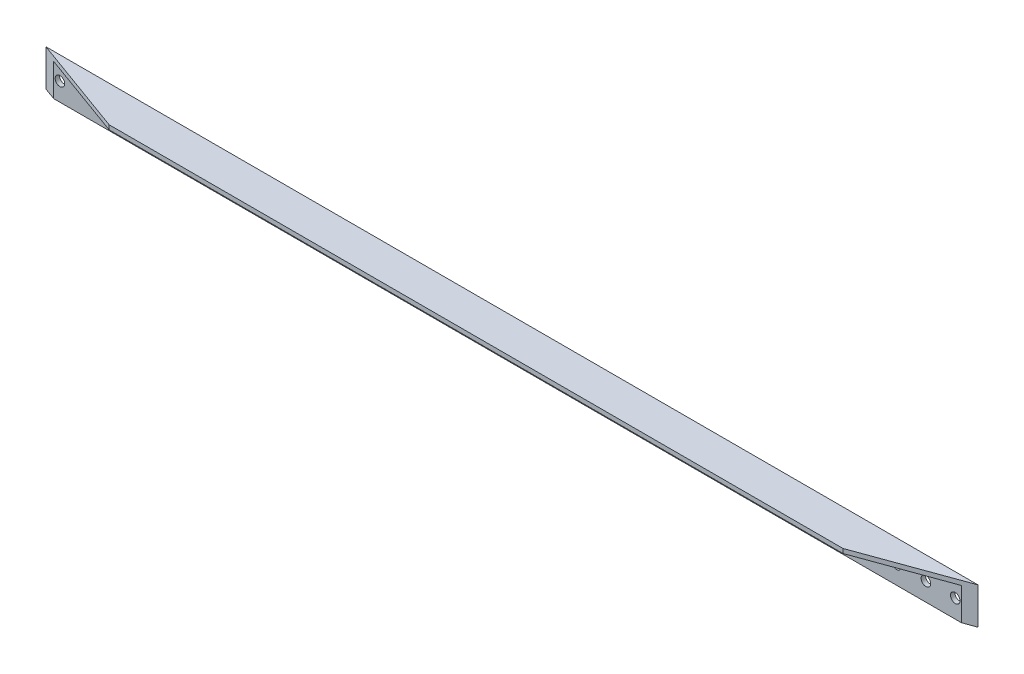
ISO-10303-21;
HEADER;
FILE_DESCRIPTION(('STEP AP214'),'2;1');
FILE_NAME('part.step','',(''),(''),'','','');
FILE_SCHEMA(('AUTOMOTIVE_DESIGN { 1 0 10303 214 1 1 1 1 }'));
ENDSEC;
DATA;
#1=APPLICATION_CONTEXT('core data for automotive mechanical design processes');
#2=APPLICATION_PROTOCOL_DEFINITION('international standard','automotive_design',2000,#1);
#3=PRODUCT_CONTEXT('',#1,'mechanical');
#4=PRODUCT('Part','Part','',(#3));
#5=PRODUCT_RELATED_PRODUCT_CATEGORY('part','',(#4));
#6=PRODUCT_DEFINITION_FORMATION('','',#4);
#7=PRODUCT_DEFINITION_CONTEXT('part definition',#1,'design');
#8=PRODUCT_DEFINITION('design','',#6,#7);
#9=PRODUCT_DEFINITION_SHAPE('','',#8);
#10=(LENGTH_UNIT() NAMED_UNIT(*) SI_UNIT(.MILLI.,.METRE.));
#11=(NAMED_UNIT(*) PLANE_ANGLE_UNIT() SI_UNIT($,.RADIAN.));
#12=(NAMED_UNIT(*) SI_UNIT($,.STERADIAN.) SOLID_ANGLE_UNIT());
#13=UNCERTAINTY_MEASURE_WITH_UNIT(LENGTH_MEASURE(1.E-05),#10,'distance_accuracy_value','');
#14=(GEOMETRIC_REPRESENTATION_CONTEXT(3) GLOBAL_UNCERTAINTY_ASSIGNED_CONTEXT((#13)) GLOBAL_UNIT_ASSIGNED_CONTEXT((#10,
#11,#12)) REPRESENTATION_CONTEXT('',''));
#15=CARTESIAN_POINT('',(0.,0.,0.));
#16=DIRECTION('',(0.,0.,1.));
#17=DIRECTION('',(1.,0.,0.));
#18=AXIS2_PLACEMENT_3D('',#15,#16,#17);
#19=CARTESIAN_POINT('',(-1270.,-50.,12.));
#20=DIRECTION('',(0.,0.,1.));
#21=DIRECTION('',(1.,0.,0.));
#22=AXIS2_PLACEMENT_3D('',#19,#20,#21);
#23=PLANE('',#22);
#24=DIRECTION('',(0.,1.,0.));
#25=VECTOR('',#24,1.);
#26=CARTESIAN_POINT('',(-1236.9387755102,-50.,12.));
#27=LINE('',#26,#25);
#28=CARTESIAN_POINT('',(-1236.9387755102,-50.,12.));
#29=VERTEX_POINT('',#28);
#30=CARTESIAN_POINT('',(-1236.9387755102,38.,12.));
#31=VERTEX_POINT('',#30);
#32=EDGE_CURVE('E250',#29,#31,#27,.T.);
#33=ORIENTED_EDGE('',*,*,#32,.F.);
#34=DIRECTION('',(1.,0.,0.));
#35=VECTOR('',#34,1.);
#36=CARTESIAN_POINT('',(-1270.,-50.,12.));
#37=LINE('',#36,#35);
#38=CARTESIAN_POINT('',(1236.9387755102,-50.,12.));
#39=VERTEX_POINT('',#38);
#40=EDGE_CURVE('E216',#29,#39,#37,.T.);
#41=ORIENTED_EDGE('',*,*,#40,.T.);
#42=DIRECTION('',(0.,-1.,0.));
#43=VECTOR('',#42,1.);
#44=CARTESIAN_POINT('',(1236.9387755102,-50.,12.));
#45=LINE('',#44,#43);
#46=CARTESIAN_POINT('',(1236.9387755102,38.,11.9999999999999));
#47=VERTEX_POINT('',#46);
#48=EDGE_CURVE('E234',#47,#39,#45,.T.);
#49=ORIENTED_EDGE('',*,*,#48,.F.);
#50=DIRECTION('',(1.,0.,0.));
#51=VECTOR('',#50,1.);
#52=CARTESIAN_POINT('',(-1270.,38.,12.));
#53=LINE('',#52,#51);
#54=EDGE_CURVE('E37',#31,#47,#53,.T.);
#55=ORIENTED_EDGE('',*,*,#54,.F.);
#56=EDGE_LOOP('',(#33,#41,#49,#55));
#57=FACE_BOUND('',#56,.T.);
#58=CARTESIAN_POINT('',(-1140.,0.,12.));
#59=DIRECTION('',(0.,0.,1.));
#60=DIRECTION('',(-1.,0.,0.));
#61=AXIS2_PLACEMENT_3D('',#58,#59,#60);
#62=CIRCLE('',#61,12.9999999999998);
#63=CARTESIAN_POINT('',(-1153.,0.,12.));
#64=VERTEX_POINT('',#63);
#65=EDGE_CURVE('E114',#64,#64,#62,.T.);
#66=ORIENTED_EDGE('',*,*,#65,.F.);
#67=EDGE_LOOP('',(#66));
#68=FACE_BOUND('',#67,.T.);
#69=CARTESIAN_POINT('',(-979.999999999999,0.,12.));
#70=DIRECTION('',(0.,0.,1.));
#71=DIRECTION('',(-1.,0.,0.));
#72=AXIS2_PLACEMENT_3D('',#69,#70,#71);
#73=CIRCLE('',#72,13.);
#74=CARTESIAN_POINT('',(-992.999999999999,0.,12.));
#75=VERTEX_POINT('',#74);
#76=EDGE_CURVE('E126',#75,#75,#73,.T.);
#77=ORIENTED_EDGE('',*,*,#76,.F.);
#78=EDGE_LOOP('',(#77));
#79=FACE_BOUND('',#78,.T.);
#80=CARTESIAN_POINT('',(-459.999999999999,0.,12.));
#81=DIRECTION('',(0.,0.,1.));
#82=DIRECTION('',(-1.,0.,0.));
#83=AXIS2_PLACEMENT_3D('',#80,#81,#82);
#84=CIRCLE('',#83,13.);
#85=CARTESIAN_POINT('',(-472.999999999999,0.,12.));
#86=VERTEX_POINT('',#85);
#87=EDGE_CURVE('E138',#86,#86,#84,.T.);
#88=ORIENTED_EDGE('',*,*,#87,.F.);
#89=EDGE_LOOP('',(#88));
#90=FACE_BOUND('',#89,.T.);
#91=CARTESIAN_POINT('',(-299.999999999999,0.,12.));
#92=DIRECTION('',(0.,0.,1.));
#93=DIRECTION('',(-1.,0.,0.));
#94=AXIS2_PLACEMENT_3D('',#91,#92,#93);
#95=CIRCLE('',#94,13.);
#96=CARTESIAN_POINT('',(-312.999999999999,0.,12.));
#97=VERTEX_POINT('',#96);
#98=EDGE_CURVE('E150',#97,#97,#95,.T.);
#99=ORIENTED_EDGE('',*,*,#98,.F.);
#100=EDGE_LOOP('',(#99));
#101=FACE_BOUND('',#100,.T.);
#102=CARTESIAN_POINT('',(179.999999999999,0.,12.));
#103=DIRECTION('',(0.,0.,1.));
#104=DIRECTION('',(1.,0.,0.));
#105=AXIS2_PLACEMENT_3D('',#102,#103,#104);
#106=CIRCLE('',#105,13.);
#107=CARTESIAN_POINT('',(192.999999999999,0.,12.));
#108=VERTEX_POINT('',#107);
#109=EDGE_CURVE('E162',#108,#108,#106,.T.);
#110=ORIENTED_EDGE('',*,*,#109,.F.);
#111=EDGE_LOOP('',(#110));
#112=FACE_BOUND('',#111,.T.);
#113=CARTESIAN_POINT('',(379.999999999999,0.,12.));
#114=DIRECTION('',(0.,0.,1.));
#115=DIRECTION('',(1.,0.,0.));
#116=AXIS2_PLACEMENT_3D('',#113,#114,#115);
#117=CIRCLE('',#116,13.);
#118=CARTESIAN_POINT('',(392.999999999999,0.,12.));
#119=VERTEX_POINT('',#118);
#120=EDGE_CURVE('E174',#119,#119,#117,.T.);
#121=ORIENTED_EDGE('',*,*,#120,.F.);
#122=EDGE_LOOP('',(#121));
#123=FACE_BOUND('',#122,.T.);
#124=CARTESIAN_POINT('',(579.999999999999,0.,12.));
#125=DIRECTION('',(0.,0.,1.));
#126=DIRECTION('',(1.,0.,0.));
#127=AXIS2_PLACEMENT_3D('',#124,#125,#126);
#128=CIRCLE('',#127,13.);
#129=CARTESIAN_POINT('',(592.999999999999,0.,12.));
#130=VERTEX_POINT('',#129);
#131=EDGE_CURVE('E186',#130,#130,#128,.T.);
#132=ORIENTED_EDGE('',*,*,#131,.F.);
#133=EDGE_LOOP('',(#132));
#134=FACE_BOUND('',#133,.T.);
#135=CARTESIAN_POINT('',(1060.,0.,12.));
#136=DIRECTION('',(0.,0.,1.));
#137=DIRECTION('',(1.,0.,0.));
#138=AXIS2_PLACEMENT_3D('',#135,#136,#137);
#139=CIRCLE('',#138,12.9999999999998);
#140=CARTESIAN_POINT('',(1073.,0.,12.));
#141=VERTEX_POINT('',#140);
#142=EDGE_CURVE('E198',#141,#141,#139,.T.);
#143=ORIENTED_EDGE('',*,*,#142,.F.);
#144=EDGE_LOOP('',(#143));
#145=FACE_BOUND('',#144,.T.);
#146=CARTESIAN_POINT('',(1220.,0.,12.));
#147=DIRECTION('',(0.,0.,1.));
#148=DIRECTION('',(1.,0.,0.));
#149=AXIS2_PLACEMENT_3D('',#146,#147,#148);
#150=CIRCLE('',#149,12.9999999999998);
#151=CARTESIAN_POINT('',(1233.,0.,12.));
#152=VERTEX_POINT('',#151);
#153=EDGE_CURVE('E210',#152,#152,#150,.T.);
#154=ORIENTED_EDGE('',*,*,#153,.F.);
#155=EDGE_LOOP('',(#154));
#156=FACE_BOUND('',#155,.T.);
#157=CARTESIAN_POINT('',(1140.,0.,12.));
#158=DIRECTION('',(0.,0.,1.));
#159=DIRECTION('',(1.,0.,0.));
#160=AXIS2_PLACEMENT_3D('',#157,#158,#159);
#161=CIRCLE('',#160,12.9999999999998);
#162=CARTESIAN_POINT('',(1153.,0.,12.));
#163=VERTEX_POINT('',#162);
#164=EDGE_CURVE('E204',#163,#163,#161,.T.);
#165=ORIENTED_EDGE('',*,*,#164,.F.);
#166=EDGE_LOOP('',(#165));
#167=FACE_BOUND('',#166,.T.);
#168=CARTESIAN_POINT('',(979.999999999999,0.,12.));
#169=DIRECTION('',(0.,0.,1.));
#170=DIRECTION('',(1.,0.,0.));
#171=AXIS2_PLACEMENT_3D('',#168,#169,#170);
#172=CIRCLE('',#171,13.);
#173=CARTESIAN_POINT('',(992.999999999999,0.,12.));
#174=VERTEX_POINT('',#173);
#175=EDGE_CURVE('E192',#174,#174,#172,.T.);
#176=ORIENTED_EDGE('',*,*,#175,.F.);
#177=EDGE_LOOP('',(#176));
#178=FACE_BOUND('',#177,.T.);
#179=CARTESIAN_POINT('',(459.999999999999,0.,12.));
#180=DIRECTION('',(0.,0.,1.));
#181=DIRECTION('',(1.,0.,0.));
#182=AXIS2_PLACEMENT_3D('',#179,#180,#181);
#183=CIRCLE('',#182,13.);
#184=CARTESIAN_POINT('',(472.999999999999,0.,12.));
#185=VERTEX_POINT('',#184);
#186=EDGE_CURVE('E180',#185,#185,#183,.T.);
#187=ORIENTED_EDGE('',*,*,#186,.F.);
#188=EDGE_LOOP('',(#187));
#189=FACE_BOUND('',#188,.T.);
#190=CARTESIAN_POINT('',(299.999999999999,0.,12.));
#191=DIRECTION('',(0.,0.,1.));
#192=DIRECTION('',(1.,0.,0.));
#193=AXIS2_PLACEMENT_3D('',#190,#191,#192);
#194=CIRCLE('',#193,13.);
#195=CARTESIAN_POINT('',(312.999999999999,0.,12.));
#196=VERTEX_POINT('',#195);
#197=EDGE_CURVE('E168',#196,#196,#194,.T.);
#198=ORIENTED_EDGE('',*,*,#197,.F.);
#199=EDGE_LOOP('',(#198));
#200=FACE_BOUND('',#199,.T.);
#201=CARTESIAN_POINT('',(-179.999999999999,0.,12.));
#202=DIRECTION('',(0.,0.,1.));
#203=DIRECTION('',(-1.,0.,0.));
#204=AXIS2_PLACEMENT_3D('',#201,#202,#203);
#205=CIRCLE('',#204,13.);
#206=CARTESIAN_POINT('',(-192.999999999999,0.,12.));
#207=VERTEX_POINT('',#206);
#208=EDGE_CURVE('E156',#207,#207,#205,.T.);
#209=ORIENTED_EDGE('',*,*,#208,.F.);
#210=EDGE_LOOP('',(#209));
#211=FACE_BOUND('',#210,.T.);
#212=CARTESIAN_POINT('',(-379.999999999999,0.,12.));
#213=DIRECTION('',(0.,0.,1.));
#214=DIRECTION('',(-1.,0.,0.));
#215=AXIS2_PLACEMENT_3D('',#212,#213,#214);
#216=CIRCLE('',#215,13.);
#217=CARTESIAN_POINT('',(-392.999999999999,0.,12.));
#218=VERTEX_POINT('',#217);
#219=EDGE_CURVE('E144',#218,#218,#216,.T.);
#220=ORIENTED_EDGE('',*,*,#219,.F.);
#221=EDGE_LOOP('',(#220));
#222=FACE_BOUND('',#221,.T.);
#223=CARTESIAN_POINT('',(-579.999999999999,0.,12.));
#224=DIRECTION('',(0.,0.,1.));
#225=DIRECTION('',(-1.,0.,0.));
#226=AXIS2_PLACEMENT_3D('',#223,#224,#225);
#227=CIRCLE('',#226,13.);
#228=CARTESIAN_POINT('',(-592.999999999999,0.,12.));
#229=VERTEX_POINT('',#228);
#230=EDGE_CURVE('E132',#229,#229,#227,.T.);
#231=ORIENTED_EDGE('',*,*,#230,.F.);
#232=EDGE_LOOP('',(#231));
#233=FACE_BOUND('',#232,.T.);
#234=CARTESIAN_POINT('',(-1060.,0.,12.));
#235=DIRECTION('',(0.,0.,1.));
#236=DIRECTION('',(-1.,0.,0.));
#237=AXIS2_PLACEMENT_3D('',#234,#235,#236);
#238=CIRCLE('',#237,12.9999999999998);
#239=CARTESIAN_POINT('',(-1073.,0.,12.));
#240=VERTEX_POINT('',#239);
#241=EDGE_CURVE('E120',#240,#240,#238,.T.);
#242=ORIENTED_EDGE('',*,*,#241,.F.);
#243=EDGE_LOOP('',(#242));
#244=FACE_BOUND('',#243,.T.);
#245=CARTESIAN_POINT('',(-1220.,0.,12.));
#246=DIRECTION('',(0.,0.,1.));
#247=DIRECTION('',(-1.,0.,0.));
#248=AXIS2_PLACEMENT_3D('',#245,#246,#247);
#249=CIRCLE('',#248,12.9999999999998);
#250=CARTESIAN_POINT('',(-1233.,0.,12.));
#251=VERTEX_POINT('',#250);
#252=EDGE_CURVE('E105',#251,#251,#249,.T.);
#253=ORIENTED_EDGE('',*,*,#252,.F.);
#254=EDGE_LOOP('',(#253));
#255=FACE_BOUND('',#254,.T.);
#256=ADVANCED_FACE('F33',(#57,#68,#79,#90,#101,#112,#123,#134,#145,#156,#167,#178,#189,#200,
#211,#222,#233,#244,#255),#23,.T.);
#257=CARTESIAN_POINT('',(-1270.,-50.,0.));
#258=DIRECTION('',(0.,0.,1.));
#259=DIRECTION('',(1.,0.,0.));
#260=AXIS2_PLACEMENT_3D('',#257,#258,#259);
#261=PLANE('',#260);
#262=CARTESIAN_POINT('',(-1140.,0.,0.));
#263=DIRECTION('',(0.,0.,1.));
#264=DIRECTION('',(-1.,0.,0.));
#265=AXIS2_PLACEMENT_3D('',#262,#263,#264);
#266=CIRCLE('',#265,12.9999999999998);
#267=CARTESIAN_POINT('',(-1153.,0.,0.));
#268=VERTEX_POINT('',#267);
#269=EDGE_CURVE('E112',#268,#268,#266,.T.);
#270=ORIENTED_EDGE('',*,*,#269,.T.);
#271=EDGE_LOOP('',(#270));
#272=FACE_BOUND('',#271,.T.);
#273=CARTESIAN_POINT('',(-979.999999999999,0.,0.));
#274=DIRECTION('',(0.,0.,1.));
#275=DIRECTION('',(-1.,0.,0.));
#276=AXIS2_PLACEMENT_3D('',#273,#274,#275);
#277=CIRCLE('',#276,13.);
#278=CARTESIAN_POINT('',(-992.999999999999,0.,0.));
#279=VERTEX_POINT('',#278);
#280=EDGE_CURVE('E123',#279,#279,#277,.T.);
#281=ORIENTED_EDGE('',*,*,#280,.T.);
#282=EDGE_LOOP('',(#281));
#283=FACE_BOUND('',#282,.T.);
#284=CARTESIAN_POINT('',(-459.999999999999,0.,0.));
#285=DIRECTION('',(0.,0.,1.));
#286=DIRECTION('',(-1.,0.,0.));
#287=AXIS2_PLACEMENT_3D('',#284,#285,#286);
#288=CIRCLE('',#287,13.);
#289=CARTESIAN_POINT('',(-472.999999999999,0.,0.));
#290=VERTEX_POINT('',#289);
#291=EDGE_CURVE('E135',#290,#290,#288,.T.);
#292=ORIENTED_EDGE('',*,*,#291,.T.);
#293=EDGE_LOOP('',(#292));
#294=FACE_BOUND('',#293,.T.);
#295=CARTESIAN_POINT('',(-299.999999999999,0.,0.));
#296=DIRECTION('',(0.,0.,1.));
#297=DIRECTION('',(-1.,0.,0.));
#298=AXIS2_PLACEMENT_3D('',#295,#296,#297);
#299=CIRCLE('',#298,13.);
#300=CARTESIAN_POINT('',(-312.999999999999,0.,0.));
#301=VERTEX_POINT('',#300);
#302=EDGE_CURVE('E147',#301,#301,#299,.T.);
#303=ORIENTED_EDGE('',*,*,#302,.T.);
#304=EDGE_LOOP('',(#303));
#305=FACE_BOUND('',#304,.T.);
#306=CARTESIAN_POINT('',(179.999999999999,0.,0.));
#307=DIRECTION('',(0.,0.,1.));
#308=DIRECTION('',(1.,0.,0.));
#309=AXIS2_PLACEMENT_3D('',#306,#307,#308);
#310=CIRCLE('',#309,13.);
#311=CARTESIAN_POINT('',(192.999999999999,0.,0.));
#312=VERTEX_POINT('',#311);
#313=EDGE_CURVE('E159',#312,#312,#310,.T.);
#314=ORIENTED_EDGE('',*,*,#313,.T.);
#315=EDGE_LOOP('',(#314));
#316=FACE_BOUND('',#315,.T.);
#317=CARTESIAN_POINT('',(379.999999999999,0.,0.));
#318=DIRECTION('',(0.,0.,1.));
#319=DIRECTION('',(1.,0.,0.));
#320=AXIS2_PLACEMENT_3D('',#317,#318,#319);
#321=CIRCLE('',#320,13.);
#322=CARTESIAN_POINT('',(392.999999999999,0.,0.));
#323=VERTEX_POINT('',#322);
#324=EDGE_CURVE('E171',#323,#323,#321,.T.);
#325=ORIENTED_EDGE('',*,*,#324,.T.);
#326=EDGE_LOOP('',(#325));
#327=FACE_BOUND('',#326,.T.);
#328=CARTESIAN_POINT('',(579.999999999999,0.,0.));
#329=DIRECTION('',(0.,0.,1.));
#330=DIRECTION('',(1.,0.,0.));
#331=AXIS2_PLACEMENT_3D('',#328,#329,#330);
#332=CIRCLE('',#331,13.);
#333=CARTESIAN_POINT('',(592.999999999999,0.,0.));
#334=VERTEX_POINT('',#333);
#335=EDGE_CURVE('E183',#334,#334,#332,.T.);
#336=ORIENTED_EDGE('',*,*,#335,.T.);
#337=EDGE_LOOP('',(#336));
#338=FACE_BOUND('',#337,.T.);
#339=CARTESIAN_POINT('',(1060.,0.,0.));
#340=DIRECTION('',(0.,0.,1.));
#341=DIRECTION('',(1.,0.,0.));
#342=AXIS2_PLACEMENT_3D('',#339,#340,#341);
#343=CIRCLE('',#342,12.9999999999998);
#344=CARTESIAN_POINT('',(1073.,0.,0.));
#345=VERTEX_POINT('',#344);
#346=EDGE_CURVE('E195',#345,#345,#343,.T.);
#347=ORIENTED_EDGE('',*,*,#346,.T.);
#348=EDGE_LOOP('',(#347));
#349=FACE_BOUND('',#348,.T.);
#350=CARTESIAN_POINT('',(1220.,0.,0.));
#351=DIRECTION('',(0.,0.,1.));
#352=DIRECTION('',(1.,0.,0.));
#353=AXIS2_PLACEMENT_3D('',#350,#351,#352);
#354=CIRCLE('',#353,12.9999999999998);
#355=CARTESIAN_POINT('',(1233.,0.,0.));
#356=VERTEX_POINT('',#355);
#357=EDGE_CURVE('E207',#356,#356,#354,.T.);
#358=ORIENTED_EDGE('',*,*,#357,.T.);
#359=EDGE_LOOP('',(#358));
#360=FACE_BOUND('',#359,.T.);
#361=DIRECTION('',(0.,-1.,0.));
#362=VECTOR('',#361,1.);
#363=CARTESIAN_POINT('',(-1270.,50.,0.));
#364=LINE('',#363,#362);
#365=CARTESIAN_POINT('',(-1270.,50.,0.));
#366=VERTEX_POINT('',#365);
#367=CARTESIAN_POINT('',(-1270.,-50.,0.));
#368=VERTEX_POINT('',#367);
#369=EDGE_CURVE('E213',#366,#368,#364,.T.);
#370=ORIENTED_EDGE('',*,*,#369,.F.);
#371=DIRECTION('',(-1.,0.,0.));
#372=VECTOR('',#371,1.);
#373=CARTESIAN_POINT('',(-1270.,50.,0.));
#374=LINE('',#373,#372);
#375=CARTESIAN_POINT('',(1270.,50.,0.));
#376=VERTEX_POINT('',#375);
#377=EDGE_CURVE('E97',#376,#366,#374,.T.);
#378=ORIENTED_EDGE('',*,*,#377,.F.);
#379=DIRECTION('',(0.,1.,0.));
#380=VECTOR('',#379,1.);
#381=CARTESIAN_POINT('',(1270.,50.,0.));
#382=LINE('',#381,#380);
#383=CARTESIAN_POINT('',(1270.,-50.,0.));
#384=VERTEX_POINT('',#383);
#385=EDGE_CURVE('E222',#384,#376,#382,.T.);
#386=ORIENTED_EDGE('',*,*,#385,.F.);
#387=DIRECTION('',(1.,0.,0.));
#388=VECTOR('',#387,1.);
#389=CARTESIAN_POINT('',(-1270.,-50.,0.));
#390=LINE('',#389,#388);
#391=EDGE_CURVE('E219',#368,#384,#390,.T.);
#392=ORIENTED_EDGE('',*,*,#391,.F.);
#393=EDGE_LOOP('',(#370,#378,#386,#392));
#394=FACE_BOUND('',#393,.T.);
#395=CARTESIAN_POINT('',(1140.,0.,0.));
#396=DIRECTION('',(0.,0.,1.));
#397=DIRECTION('',(1.,0.,0.));
#398=AXIS2_PLACEMENT_3D('',#395,#396,#397);
#399=CIRCLE('',#398,12.9999999999998);
#400=CARTESIAN_POINT('',(1153.,0.,0.));
#401=VERTEX_POINT('',#400);
#402=EDGE_CURVE('E201',#401,#401,#399,.T.);
#403=ORIENTED_EDGE('',*,*,#402,.T.);
#404=EDGE_LOOP('',(#403));
#405=FACE_BOUND('',#404,.T.);
#406=CARTESIAN_POINT('',(979.999999999999,0.,0.));
#407=DIRECTION('',(0.,0.,1.));
#408=DIRECTION('',(1.,0.,0.));
#409=AXIS2_PLACEMENT_3D('',#406,#407,#408);
#410=CIRCLE('',#409,13.);
#411=CARTESIAN_POINT('',(992.999999999999,0.,0.));
#412=VERTEX_POINT('',#411);
#413=EDGE_CURVE('E189',#412,#412,#410,.T.);
#414=ORIENTED_EDGE('',*,*,#413,.T.);
#415=EDGE_LOOP('',(#414));
#416=FACE_BOUND('',#415,.T.);
#417=CARTESIAN_POINT('',(459.999999999999,0.,0.));
#418=DIRECTION('',(0.,0.,1.));
#419=DIRECTION('',(1.,0.,0.));
#420=AXIS2_PLACEMENT_3D('',#417,#418,#419);
#421=CIRCLE('',#420,13.);
#422=CARTESIAN_POINT('',(472.999999999999,0.,0.));
#423=VERTEX_POINT('',#422);
#424=EDGE_CURVE('E177',#423,#423,#421,.T.);
#425=ORIENTED_EDGE('',*,*,#424,.T.);
#426=EDGE_LOOP('',(#425));
#427=FACE_BOUND('',#426,.T.);
#428=CARTESIAN_POINT('',(299.999999999999,0.,0.));
#429=DIRECTION('',(0.,0.,1.));
#430=DIRECTION('',(1.,0.,0.));
#431=AXIS2_PLACEMENT_3D('',#428,#429,#430);
#432=CIRCLE('',#431,13.);
#433=CARTESIAN_POINT('',(312.999999999999,0.,0.));
#434=VERTEX_POINT('',#433);
#435=EDGE_CURVE('E165',#434,#434,#432,.T.);
#436=ORIENTED_EDGE('',*,*,#435,.T.);
#437=EDGE_LOOP('',(#436));
#438=FACE_BOUND('',#437,.T.);
#439=CARTESIAN_POINT('',(-179.999999999999,0.,0.));
#440=DIRECTION('',(0.,0.,1.));
#441=DIRECTION('',(-1.,0.,0.));
#442=AXIS2_PLACEMENT_3D('',#439,#440,#441);
#443=CIRCLE('',#442,13.);
#444=CARTESIAN_POINT('',(-192.999999999999,0.,0.));
#445=VERTEX_POINT('',#444);
#446=EDGE_CURVE('E153',#445,#445,#443,.T.);
#447=ORIENTED_EDGE('',*,*,#446,.T.);
#448=EDGE_LOOP('',(#447));
#449=FACE_BOUND('',#448,.T.);
#450=CARTESIAN_POINT('',(-379.999999999999,0.,0.));
#451=DIRECTION('',(0.,0.,1.));
#452=DIRECTION('',(-1.,0.,0.));
#453=AXIS2_PLACEMENT_3D('',#450,#451,#452);
#454=CIRCLE('',#453,13.);
#455=CARTESIAN_POINT('',(-392.999999999999,0.,0.));
#456=VERTEX_POINT('',#455);
#457=EDGE_CURVE('E141',#456,#456,#454,.T.);
#458=ORIENTED_EDGE('',*,*,#457,.T.);
#459=EDGE_LOOP('',(#458));
#460=FACE_BOUND('',#459,.T.);
#461=CARTESIAN_POINT('',(-579.999999999999,0.,0.));
#462=DIRECTION('',(0.,0.,1.));
#463=DIRECTION('',(-1.,0.,0.));
#464=AXIS2_PLACEMENT_3D('',#461,#462,#463);
#465=CIRCLE('',#464,13.);
#466=CARTESIAN_POINT('',(-592.999999999999,0.,0.));
#467=VERTEX_POINT('',#466);
#468=EDGE_CURVE('E129',#467,#467,#465,.T.);
#469=ORIENTED_EDGE('',*,*,#468,.T.);
#470=EDGE_LOOP('',(#469));
#471=FACE_BOUND('',#470,.T.);
#472=CARTESIAN_POINT('',(-1060.,0.,0.));
#473=DIRECTION('',(0.,0.,1.));
#474=DIRECTION('',(-1.,0.,0.));
#475=AXIS2_PLACEMENT_3D('',#472,#473,#474);
#476=CIRCLE('',#475,12.9999999999998);
#477=CARTESIAN_POINT('',(-1073.,0.,0.));
#478=VERTEX_POINT('',#477);
#479=EDGE_CURVE('E117',#478,#478,#476,.T.);
#480=ORIENTED_EDGE('',*,*,#479,.T.);
#481=EDGE_LOOP('',(#480));
#482=FACE_BOUND('',#481,.T.);
#483=CARTESIAN_POINT('',(-1220.,0.,0.));
#484=DIRECTION('',(0.,0.,1.));
#485=DIRECTION('',(-1.,0.,0.));
#486=AXIS2_PLACEMENT_3D('',#483,#484,#485);
#487=CIRCLE('',#486,12.9999999999998);
#488=CARTESIAN_POINT('',(-1233.,0.,0.));
#489=VERTEX_POINT('',#488);
#490=EDGE_CURVE('E101',#489,#489,#487,.T.);
#491=ORIENTED_EDGE('',*,*,#490,.T.);
#492=EDGE_LOOP('',(#491));
#493=FACE_BOUND('',#492,.T.);
#494=ADVANCED_FACE('F254',(#272,#283,#294,#305,#316,#327,#338,#349,#360,#394,#405,#416,#427,
#438,#449,#460,#471,#482,#493),#261,.F.);
#495=CARTESIAN_POINT('',(-1270.,-50.,12.));
#496=DIRECTION('',(0.,1.,0.));
#497=DIRECTION('',(0.,0.,1.));
#498=AXIS2_PLACEMENT_3D('',#495,#496,#497);
#499=PLANE('',#498);
#500=ORIENTED_EDGE('',*,*,#40,.F.);
#501=DIRECTION('',(-0.939996554641713,0.,-0.341183934647733));
#502=VECTOR('',#501,1.);
#503=CARTESIAN_POINT('',(-1266.15145932318,-50.,1.39687772714057));
#504=LINE('',#503,#502);
#505=EDGE_CURVE('E238',#29,#368,#504,.T.);
#506=ORIENTED_EDGE('',*,*,#505,.T.);
#507=ORIENTED_EDGE('',*,*,#391,.T.);
#508=DIRECTION('',(-0.939996554641713,0.,0.341183934647733));
#509=VECTOR('',#508,1.);
#510=CARTESIAN_POINT('',(-978.176088432076,-50.,816.004654319791));
#511=LINE('',#510,#509);
#512=EDGE_CURVE('E236',#384,#39,#511,.T.);
#513=ORIENTED_EDGE('',*,*,#512,.T.);
#514=EDGE_LOOP('',(#500,#506,#507,#513));
#515=FACE_BOUND('',#514,.T.);
#516=ADVANCED_FACE('F35',(#515),#499,.F.);
#517=CARTESIAN_POINT('',(-1270.,50.,12.));
#518=DIRECTION('',(0.,-1.,0.));
#519=DIRECTION('',(0.,0.,-1.));
#520=AXIS2_PLACEMENT_3D('',#517,#518,#519);
#521=PLANE('',#520);
#522=ORIENTED_EDGE('',*,*,#377,.T.);
#523=DIRECTION('',(-0.939996554641713,0.,-0.341183934647733));
#524=VECTOR('',#523,1.);
#525=CARTESIAN_POINT('',(-1270.,50.,0.));
#526=LINE('',#525,#524);
#527=CARTESIAN_POINT('',(-1000.,50.,98.));
#528=VERTEX_POINT('',#527);
#529=EDGE_CURVE('E87',#528,#366,#526,.T.);
#530=ORIENTED_EDGE('',*,*,#529,.F.);
#531=DIRECTION('',(-1.,0.,0.));
#532=VECTOR('',#531,1.);
#533=CARTESIAN_POINT('',(-1270.,50.,98.));
#534=LINE('',#533,#532);
#535=CARTESIAN_POINT('',(999.999999999999,50.,98.));
#536=VERTEX_POINT('',#535);
#537=EDGE_CURVE('E95',#536,#528,#534,.T.);
#538=ORIENTED_EDGE('',*,*,#537,.F.);
#539=DIRECTION('',(-0.939996554641713,0.,0.341183934647733));
#540=VECTOR('',#539,1.);
#541=CARTESIAN_POINT('',(1270.,50.,0.));
#542=LINE('',#541,#540);
#543=EDGE_CURVE('E57',#376,#536,#542,.T.);
#544=ORIENTED_EDGE('',*,*,#543,.F.);
#545=EDGE_LOOP('',(#522,#530,#538,#544));
#546=FACE_BOUND('',#545,.T.);
#547=ADVANCED_FACE('F94',(#546),#521,.F.);
#548=CARTESIAN_POINT('',(1220.,0.,12.));
#549=DIRECTION('',(0.,0.,-1.));
#550=DIRECTION('',(-1.,0.,0.));
#551=AXIS2_PLACEMENT_3D('',#548,#549,#550);
#552=CYLINDRICAL_SURFACE('',#551,12.9999999999998);
#553=ORIENTED_EDGE('',*,*,#153,.T.);
#554=EDGE_LOOP('',(#553));
#555=FACE_BOUND('',#554,.T.);
#556=ORIENTED_EDGE('',*,*,#357,.F.);
#557=EDGE_LOOP('',(#556));
#558=FACE_BOUND('',#557,.T.);
#559=ADVANCED_FACE('F295',(#555,#558),#552,.F.);
#560=CARTESIAN_POINT('',(1140.,0.,12.));
#561=DIRECTION('',(0.,0.,-1.));
#562=DIRECTION('',(-1.,0.,0.));
#563=AXIS2_PLACEMENT_3D('',#560,#561,#562);
#564=CYLINDRICAL_SURFACE('',#563,12.9999999999998);
#565=ORIENTED_EDGE('',*,*,#164,.T.);
#566=EDGE_LOOP('',(#565));
#567=FACE_BOUND('',#566,.T.);
#568=ORIENTED_EDGE('',*,*,#402,.F.);
#569=EDGE_LOOP('',(#568));
#570=FACE_BOUND('',#569,.T.);
#571=ADVANCED_FACE('F302',(#567,#570),#564,.F.);
#572=CARTESIAN_POINT('',(1060.,0.,12.));
#573=DIRECTION('',(0.,0.,-1.));
#574=DIRECTION('',(-1.,0.,0.));
#575=AXIS2_PLACEMENT_3D('',#572,#573,#574);
#576=CYLINDRICAL_SURFACE('',#575,12.9999999999998);
#577=ORIENTED_EDGE('',*,*,#142,.T.);
#578=EDGE_LOOP('',(#577));
#579=FACE_BOUND('',#578,.T.);
#580=ORIENTED_EDGE('',*,*,#346,.F.);
#581=EDGE_LOOP('',(#580));
#582=FACE_BOUND('',#581,.T.);
#583=ADVANCED_FACE('F454',(#579,#582),#576,.F.);
#584=CARTESIAN_POINT('',(979.999999999999,0.,12.));
#585=DIRECTION('',(0.,0.,-1.));
#586=DIRECTION('',(-1.,0.,0.));
#587=AXIS2_PLACEMENT_3D('',#584,#585,#586);
#588=CYLINDRICAL_SURFACE('',#587,13.);
#589=ORIENTED_EDGE('',*,*,#175,.T.);
#590=EDGE_LOOP('',(#589));
#591=FACE_BOUND('',#590,.T.);
#592=ORIENTED_EDGE('',*,*,#413,.F.);
#593=EDGE_LOOP('',(#592));
#594=FACE_BOUND('',#593,.T.);
#595=ADVANCED_FACE('F444',(#591,#594),#588,.F.);
#596=CARTESIAN_POINT('',(579.999999999999,0.,12.));
#597=DIRECTION('',(0.,0.,-1.));
#598=DIRECTION('',(-1.,0.,0.));
#599=AXIS2_PLACEMENT_3D('',#596,#597,#598);
#600=CYLINDRICAL_SURFACE('',#599,13.);
#601=ORIENTED_EDGE('',*,*,#131,.T.);
#602=EDGE_LOOP('',(#601));
#603=FACE_BOUND('',#602,.T.);
#604=ORIENTED_EDGE('',*,*,#335,.F.);
#605=EDGE_LOOP('',(#604));
#606=FACE_BOUND('',#605,.T.);
#607=ADVANCED_FACE('F434',(#603,#606),#600,.F.);
#608=CARTESIAN_POINT('',(459.999999999999,0.,12.));
#609=DIRECTION('',(0.,0.,-1.));
#610=DIRECTION('',(-1.,0.,0.));
#611=AXIS2_PLACEMENT_3D('',#608,#609,#610);
#612=CYLINDRICAL_SURFACE('',#611,13.);
#613=ORIENTED_EDGE('',*,*,#186,.T.);
#614=EDGE_LOOP('',(#613));
#615=FACE_BOUND('',#614,.T.);
#616=ORIENTED_EDGE('',*,*,#424,.F.);
#617=EDGE_LOOP('',(#616));
#618=FACE_BOUND('',#617,.T.);
#619=ADVANCED_FACE('F424',(#615,#618),#612,.F.);
#620=CARTESIAN_POINT('',(379.999999999999,0.,12.));
#621=DIRECTION('',(0.,0.,-1.));
#622=DIRECTION('',(-1.,0.,0.));
#623=AXIS2_PLACEMENT_3D('',#620,#621,#622);
#624=CYLINDRICAL_SURFACE('',#623,13.);
#625=ORIENTED_EDGE('',*,*,#120,.T.);
#626=EDGE_LOOP('',(#625));
#627=FACE_BOUND('',#626,.T.);
#628=ORIENTED_EDGE('',*,*,#324,.F.);
#629=EDGE_LOOP('',(#628));
#630=FACE_BOUND('',#629,.T.);
#631=ADVANCED_FACE('F414',(#627,#630),#624,.F.);
#632=CARTESIAN_POINT('',(299.999999999999,0.,12.));
#633=DIRECTION('',(0.,0.,-1.));
#634=DIRECTION('',(-1.,0.,0.));
#635=AXIS2_PLACEMENT_3D('',#632,#633,#634);
#636=CYLINDRICAL_SURFACE('',#635,13.);
#637=ORIENTED_EDGE('',*,*,#197,.T.);
#638=EDGE_LOOP('',(#637));
#639=FACE_BOUND('',#638,.T.);
#640=ORIENTED_EDGE('',*,*,#435,.F.);
#641=EDGE_LOOP('',(#640));
#642=FACE_BOUND('',#641,.T.);
#643=ADVANCED_FACE('F404',(#639,#642),#636,.F.);
#644=CARTESIAN_POINT('',(179.999999999999,0.,12.));
#645=DIRECTION('',(0.,0.,-1.));
#646=DIRECTION('',(-1.,0.,0.));
#647=AXIS2_PLACEMENT_3D('',#644,#645,#646);
#648=CYLINDRICAL_SURFACE('',#647,13.);
#649=ORIENTED_EDGE('',*,*,#109,.T.);
#650=EDGE_LOOP('',(#649));
#651=FACE_BOUND('',#650,.T.);
#652=ORIENTED_EDGE('',*,*,#313,.F.);
#653=EDGE_LOOP('',(#652));
#654=FACE_BOUND('',#653,.T.);
#655=ADVANCED_FACE('F394',(#651,#654),#648,.F.);
#656=CARTESIAN_POINT('',(-179.999999999999,0.,12.));
#657=DIRECTION('',(0.,0.,-1.));
#658=DIRECTION('',(-1.,0.,0.));
#659=AXIS2_PLACEMENT_3D('',#656,#657,#658);
#660=CYLINDRICAL_SURFACE('',#659,13.);
#661=ORIENTED_EDGE('',*,*,#208,.T.);
#662=EDGE_LOOP('',(#661));
#663=FACE_BOUND('',#662,.T.);
#664=ORIENTED_EDGE('',*,*,#446,.F.);
#665=EDGE_LOOP('',(#664));
#666=FACE_BOUND('',#665,.T.);
#667=ADVANCED_FACE('F384',(#663,#666),#660,.F.);
#668=CARTESIAN_POINT('',(-299.999999999999,0.,12.));
#669=DIRECTION('',(0.,0.,-1.));
#670=DIRECTION('',(-1.,0.,0.));
#671=AXIS2_PLACEMENT_3D('',#668,#669,#670);
#672=CYLINDRICAL_SURFACE('',#671,13.);
#673=ORIENTED_EDGE('',*,*,#98,.T.);
#674=EDGE_LOOP('',(#673));
#675=FACE_BOUND('',#674,.T.);
#676=ORIENTED_EDGE('',*,*,#302,.F.);
#677=EDGE_LOOP('',(#676));
#678=FACE_BOUND('',#677,.T.);
#679=ADVANCED_FACE('F374',(#675,#678),#672,.F.);
#680=CARTESIAN_POINT('',(-379.999999999999,0.,12.));
#681=DIRECTION('',(0.,0.,-1.));
#682=DIRECTION('',(-1.,0.,0.));
#683=AXIS2_PLACEMENT_3D('',#680,#681,#682);
#684=CYLINDRICAL_SURFACE('',#683,13.);
#685=ORIENTED_EDGE('',*,*,#219,.T.);
#686=EDGE_LOOP('',(#685));
#687=FACE_BOUND('',#686,.T.);
#688=ORIENTED_EDGE('',*,*,#457,.F.);
#689=EDGE_LOOP('',(#688));
#690=FACE_BOUND('',#689,.T.);
#691=ADVANCED_FACE('F364',(#687,#690),#684,.F.);
#692=CARTESIAN_POINT('',(-459.999999999999,0.,12.));
#693=DIRECTION('',(0.,0.,-1.));
#694=DIRECTION('',(-1.,0.,0.));
#695=AXIS2_PLACEMENT_3D('',#692,#693,#694);
#696=CYLINDRICAL_SURFACE('',#695,13.);
#697=ORIENTED_EDGE('',*,*,#87,.T.);
#698=EDGE_LOOP('',(#697));
#699=FACE_BOUND('',#698,.T.);
#700=ORIENTED_EDGE('',*,*,#291,.F.);
#701=EDGE_LOOP('',(#700));
#702=FACE_BOUND('',#701,.T.);
#703=ADVANCED_FACE('F354',(#699,#702),#696,.F.);
#704=CARTESIAN_POINT('',(-579.999999999999,0.,12.));
#705=DIRECTION('',(0.,0.,-1.));
#706=DIRECTION('',(-1.,0.,0.));
#707=AXIS2_PLACEMENT_3D('',#704,#705,#706);
#708=CYLINDRICAL_SURFACE('',#707,13.);
#709=ORIENTED_EDGE('',*,*,#230,.T.);
#710=EDGE_LOOP('',(#709));
#711=FACE_BOUND('',#710,.T.);
#712=ORIENTED_EDGE('',*,*,#468,.F.);
#713=EDGE_LOOP('',(#712));
#714=FACE_BOUND('',#713,.T.);
#715=ADVANCED_FACE('F344',(#711,#714),#708,.F.);
#716=CARTESIAN_POINT('',(-979.999999999999,0.,12.));
#717=DIRECTION('',(0.,0.,-1.));
#718=DIRECTION('',(-1.,0.,0.));
#719=AXIS2_PLACEMENT_3D('',#716,#717,#718);
#720=CYLINDRICAL_SURFACE('',#719,13.);
#721=ORIENTED_EDGE('',*,*,#76,.T.);
#722=EDGE_LOOP('',(#721));
#723=FACE_BOUND('',#722,.T.);
#724=ORIENTED_EDGE('',*,*,#280,.F.);
#725=EDGE_LOOP('',(#724));
#726=FACE_BOUND('',#725,.T.);
#727=ADVANCED_FACE('F334',(#723,#726),#720,.F.);
#728=CARTESIAN_POINT('',(-1060.,0.,12.));
#729=DIRECTION('',(0.,0.,-1.));
#730=DIRECTION('',(-1.,0.,0.));
#731=AXIS2_PLACEMENT_3D('',#728,#729,#730);
#732=CYLINDRICAL_SURFACE('',#731,12.9999999999998);
#733=ORIENTED_EDGE('',*,*,#241,.T.);
#734=EDGE_LOOP('',(#733));
#735=FACE_BOUND('',#734,.T.);
#736=ORIENTED_EDGE('',*,*,#479,.F.);
#737=EDGE_LOOP('',(#736));
#738=FACE_BOUND('',#737,.T.);
#739=ADVANCED_FACE('F287',(#735,#738),#732,.F.);
#740=CARTESIAN_POINT('',(-1140.,0.,12.));
#741=DIRECTION('',(0.,0.,-1.));
#742=DIRECTION('',(-1.,0.,0.));
#743=AXIS2_PLACEMENT_3D('',#740,#741,#742);
#744=CYLINDRICAL_SURFACE('',#743,12.9999999999998);
#745=ORIENTED_EDGE('',*,*,#65,.T.);
#746=EDGE_LOOP('',(#745));
#747=FACE_BOUND('',#746,.T.);
#748=ORIENTED_EDGE('',*,*,#269,.F.);
#749=EDGE_LOOP('',(#748));
#750=FACE_BOUND('',#749,.T.);
#751=ADVANCED_FACE('F279',(#747,#750),#744,.F.);
#752=CARTESIAN_POINT('',(-1220.,0.,12.));
#753=DIRECTION('',(0.,0.,-1.));
#754=DIRECTION('',(-1.,0.,0.));
#755=AXIS2_PLACEMENT_3D('',#752,#753,#754);
#756=CYLINDRICAL_SURFACE('',#755,12.9999999999998);
#757=ORIENTED_EDGE('',*,*,#252,.T.);
#758=EDGE_LOOP('',(#757));
#759=FACE_BOUND('',#758,.T.);
#760=ORIENTED_EDGE('',*,*,#490,.F.);
#761=EDGE_LOOP('',(#760));
#762=FACE_BOUND('',#761,.T.);
#763=ADVANCED_FACE('F277',(#759,#762),#756,.F.);
#764=CARTESIAN_POINT('',(-1270.,38.,98.));
#765=DIRECTION('',(0.,1.,0.));
#766=DIRECTION('',(0.,0.,1.));
#767=AXIS2_PLACEMENT_3D('',#764,#765,#766);
#768=PLANE('',#767);
#769=DIRECTION('',(1.,0.,0.));
#770=VECTOR('',#769,1.);
#771=CARTESIAN_POINT('',(-1270.,38.,98.));
#772=LINE('',#771,#770);
#773=CARTESIAN_POINT('',(-1000.,38.,98.));
#774=VERTEX_POINT('',#773);
#775=CARTESIAN_POINT('',(1000.,38.,98.));
#776=VERTEX_POINT('',#775);
#777=EDGE_CURVE('E102',#774,#776,#772,.T.);
#778=ORIENTED_EDGE('',*,*,#777,.F.);
#779=DIRECTION('',(-0.939996554641713,0.,-0.341183934647733));
#780=VECTOR('',#779,1.);
#781=CARTESIAN_POINT('',(-1238.57025113934,38.,11.4078347716475));
#782=LINE('',#781,#780);
#783=EDGE_CURVE('E49',#774,#31,#782,.T.);
#784=ORIENTED_EDGE('',*,*,#783,.T.);
#785=ORIENTED_EDGE('',*,*,#54,.T.);
#786=DIRECTION('',(-0.939996554641713,0.,0.341183934647733));
#787=VECTOR('',#786,1.);
#788=CARTESIAN_POINT('',(-1005.75729661592,38.,826.015611364297));
#789=LINE('',#788,#787);
#790=EDGE_CURVE('E229',#47,#776,#789,.T.);
#791=ORIENTED_EDGE('',*,*,#790,.T.);
#792=EDGE_LOOP('',(#778,#784,#785,#791));
#793=FACE_BOUND('',#792,.T.);
#794=ADVANCED_FACE('F232',(#793),#768,.F.);
#795=CARTESIAN_POINT('',(-1270.,38.,98.));
#796=DIRECTION('',(0.,0.,1.));
#797=DIRECTION('',(1.,0.,0.));
#798=AXIS2_PLACEMENT_3D('',#795,#796,#797);
#799=PLANE('',#798);
#800=DIRECTION('',(0.,1.,0.));
#801=VECTOR('',#800,1.);
#802=CARTESIAN_POINT('',(-1000.,38.,98.));
#803=LINE('',#802,#801);
#804=EDGE_CURVE('E11',#774,#528,#803,.T.);
#805=ORIENTED_EDGE('',*,*,#804,.F.);
#806=ORIENTED_EDGE('',*,*,#777,.T.);
#807=DIRECTION('',(0.,-1.,0.));
#808=VECTOR('',#807,1.);
#809=CARTESIAN_POINT('',(1000.,38.,98.));
#810=LINE('',#809,#808);
#811=EDGE_CURVE('E43',#536,#776,#810,.T.);
#812=ORIENTED_EDGE('',*,*,#811,.F.);
#813=ORIENTED_EDGE('',*,*,#537,.T.);
#814=EDGE_LOOP('',(#805,#806,#812,#813));
#815=FACE_BOUND('',#814,.T.);
#816=ADVANCED_FACE('F100',(#815),#799,.T.);
#817=CARTESIAN_POINT('',(1270.,-50.000025,0.));
#818=DIRECTION('',(-0.341183934647733,0.,-0.939996554641713));
#819=DIRECTION('',(-0.939996554641713,0.,0.341183934647733));
#820=AXIS2_PLACEMENT_3D('',#817,#818,#819);
#821=PLANE('',#820);
#822=ORIENTED_EDGE('',*,*,#385,.T.);
#823=ORIENTED_EDGE('',*,*,#543,.T.);
#824=ORIENTED_EDGE('',*,*,#811,.T.);
#825=ORIENTED_EDGE('',*,*,#790,.F.);
#826=ORIENTED_EDGE('',*,*,#48,.T.);
#827=ORIENTED_EDGE('',*,*,#512,.F.);
#828=EDGE_LOOP('',(#822,#823,#824,#825,#826,#827));
#829=FACE_BOUND('',#828,.T.);
#830=ADVANCED_FACE('F227',(#829),#821,.F.);
#831=CARTESIAN_POINT('',(-1270.,-50.000025,0.));
#832=DIRECTION('',(0.341183934647733,0.,-0.939996554641713));
#833=DIRECTION('',(-0.939996554641713,0.,-0.341183934647733));
#834=AXIS2_PLACEMENT_3D('',#831,#832,#833);
#835=PLANE('',#834);
#836=ORIENTED_EDGE('',*,*,#32,.T.);
#837=ORIENTED_EDGE('',*,*,#783,.F.);
#838=ORIENTED_EDGE('',*,*,#804,.T.);
#839=ORIENTED_EDGE('',*,*,#529,.T.);
#840=ORIENTED_EDGE('',*,*,#369,.T.);
#841=ORIENTED_EDGE('',*,*,#505,.F.);
#842=EDGE_LOOP('',(#836,#837,#838,#839,#840,#841));
#843=FACE_BOUND('',#842,.T.);
#844=ADVANCED_FACE('F86',(#843),#835,.F.);
#845=CLOSED_SHELL('',(#256,#494,#516,#547,#559,#571,#583,#595,#607,#619,#631,#643,#655,#667,
#679,#691,#703,#715,#727,#739,#751,#763,#794,#816,#830,#844));
#846=MANIFOLD_SOLID_BREP('B2',#845);
#847=ADVANCED_BREP_SHAPE_REPRESENTATION('',(#18,#846),#14);
#848=SHAPE_DEFINITION_REPRESENTATION(#9,#847);
ENDSEC;
END-ISO-10303-21;
